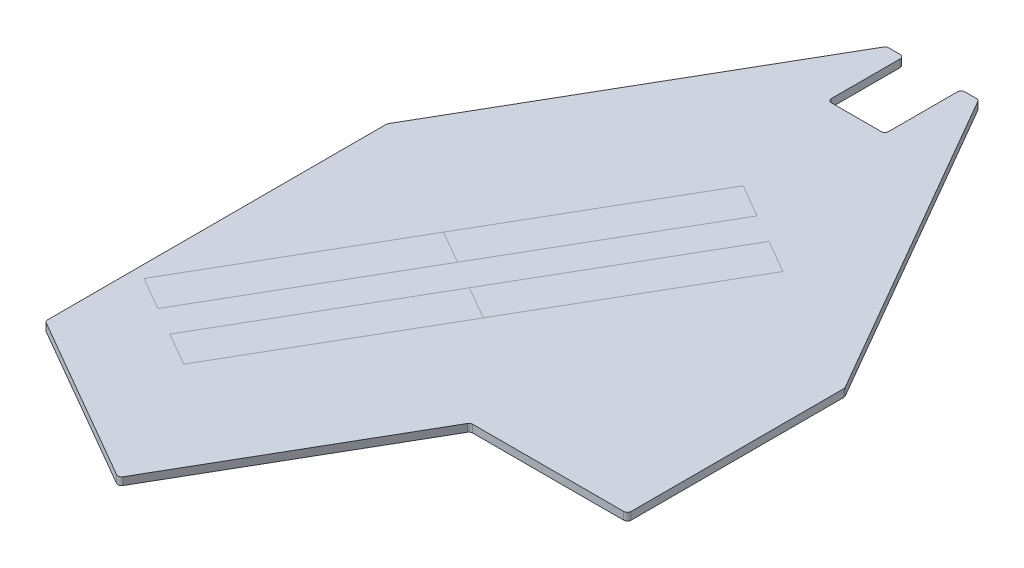
ISO-10303-21;
HEADER;
FILE_DESCRIPTION(('STEP AP214'),'2;1');
FILE_NAME('part.step','',(''),(''),'','','');
FILE_SCHEMA(('AUTOMOTIVE_DESIGN { 1 0 10303 214 1 1 1 1 }'));
ENDSEC;
DATA;
#1=APPLICATION_CONTEXT('core data for automotive mechanical design processes');
#2=APPLICATION_PROTOCOL_DEFINITION('international standard','automotive_design',2000,#1);
#3=PRODUCT_CONTEXT('',#1,'mechanical');
#4=PRODUCT('Part','Part','',(#3));
#5=PRODUCT_RELATED_PRODUCT_CATEGORY('part','',(#4));
#6=PRODUCT_DEFINITION_FORMATION('','',#4);
#7=PRODUCT_DEFINITION_CONTEXT('part definition',#1,'design');
#8=PRODUCT_DEFINITION('design','',#6,#7);
#9=PRODUCT_DEFINITION_SHAPE('','',#8);
#10=(LENGTH_UNIT() NAMED_UNIT(*) SI_UNIT(.MILLI.,.METRE.));
#11=(NAMED_UNIT(*) PLANE_ANGLE_UNIT() SI_UNIT($,.RADIAN.));
#12=(NAMED_UNIT(*) SI_UNIT($,.STERADIAN.) SOLID_ANGLE_UNIT());
#13=UNCERTAINTY_MEASURE_WITH_UNIT(LENGTH_MEASURE(1.E-05),#10,'distance_accuracy_value','');
#14=(GEOMETRIC_REPRESENTATION_CONTEXT(3) GLOBAL_UNCERTAINTY_ASSIGNED_CONTEXT((#13)) GLOBAL_UNIT_ASSIGNED_CONTEXT((#10,
#11,#12)) REPRESENTATION_CONTEXT('',''));
#15=CARTESIAN_POINT('',(0.,0.,0.));
#16=DIRECTION('',(0.,0.,1.));
#17=DIRECTION('',(1.,0.,0.));
#18=AXIS2_PLACEMENT_3D('',#15,#16,#17);
#19=CARTESIAN_POINT('',(-590.,20.,-567.320508075689));
#20=DIRECTION('',(0.,-1.,0.));
#21=DIRECTION('',(0.,0.,-1.));
#22=AXIS2_PLACEMENT_3D('',#19,#20,#21);
#23=PLANE('',#22);
#24=DIRECTION('',(0.866025403784438,0.,0.500000000000001));
#25=VECTOR('',#24,1.);
#26=CARTESIAN_POINT('',(-585.838374898212,20.,-574.52865419404));
#27=LINE('',#26,#25);
#28=CARTESIAN_POINT('',(-119.905707500847,20.,-305.52230324793));
#29=VERTEX_POINT('',#28);
#30=CARTESIAN_POINT('',(-33.3031671224033,20.,-255.52230324793));
#31=VERTEX_POINT('',#30);
#32=EDGE_CURVE('E11',#29,#31,#27,.T.);
#33=ORIENTED_EDGE('',*,*,#32,.F.);
#34=DIRECTION('',(-0.5,0.,0.866025403784439));
#35=VECTOR('',#34,1.);
#36=CARTESIAN_POINT('',(-124.067332602635,20.,-298.31415712958));
#37=LINE('',#36,#35);
#38=CARTESIAN_POINT('',(-407.405707500847,20.,192.442303928122));
#39=VERTEX_POINT('',#38);
#40=EDGE_CURVE('E328',#29,#39,#37,.T.);
#41=ORIENTED_EDGE('',*,*,#40,.T.);
#42=DIRECTION('',(0.866025403784439,0.,0.5));
#43=VECTOR('',#42,1.);
#44=CARTESIAN_POINT('',(-873.338374898212,20.,-76.5640470179867));
#45=LINE('',#44,#43);
#46=CARTESIAN_POINT('',(-320.803167122403,20.,242.442303928122));
#47=VERTEX_POINT('',#46);
#48=EDGE_CURVE('E339',#39,#47,#45,.T.);
#49=ORIENTED_EDGE('',*,*,#48,.T.);
#50=DIRECTION('',(0.5,0.,-0.866025403784439));
#51=VECTOR('',#50,1.);
#52=CARTESIAN_POINT('',(-37.464792224191,20.,-248.31415712958));
#53=LINE('',#52,#51);
#54=EDGE_CURVE('E336',#47,#31,#53,.T.);
#55=ORIENTED_EDGE('',*,*,#54,.T.);
#56=EDGE_LOOP('',(#33,#41,#49,#55));
#57=FACE_BOUND('',#56,.T.);
#58=ADVANCED_FACE('F46',(#57),#23,.F.);
#59=DIRECTION('',(0.866025403784438,0.,0.500000000000001));
#60=VECTOR('',#59,1.);
#61=CARTESIAN_POINT('',(-585.838374898212,20.,-574.52865419404));
#62=LINE('',#61,#60);
#63=CARTESIAN_POINT('',(-280.120407200968,20.,-398.02230324793));
#64=VERTEX_POINT('',#63);
#65=CARTESIAN_POINT('',(-193.517866822525,20.,-348.02230324793));
#66=VERTEX_POINT('',#65);
#67=EDGE_CURVE('E55',#64,#66,#62,.T.);
#68=ORIENTED_EDGE('',*,*,#67,.F.);
#69=DIRECTION('',(-0.5,0.,0.866025403784439));
#70=VECTOR('',#69,1.);
#71=CARTESIAN_POINT('',(-284.282032302756,20.,-390.81415712958));
#72=LINE('',#71,#70);
#73=CARTESIAN_POINT('',(-567.620407200969,20.,99.9423039281221));
#74=VERTEX_POINT('',#73);
#75=EDGE_CURVE('E354',#64,#74,#72,.T.);
#76=ORIENTED_EDGE('',*,*,#75,.T.);
#77=DIRECTION('',(0.866025403784439,0.,0.5));
#78=VECTOR('',#77,1.);
#79=CARTESIAN_POINT('',(-873.338374898212,20.,-76.5640470179867));
#80=LINE('',#79,#78);
#81=CARTESIAN_POINT('',(-481.017866822524,20.,149.942303928122));
#82=VERTEX_POINT('',#81);
#83=EDGE_CURVE('E351',#74,#82,#80,.T.);
#84=ORIENTED_EDGE('',*,*,#83,.T.);
#85=DIRECTION('',(0.5,0.,-0.866025403784439));
#86=VECTOR('',#85,1.);
#87=CARTESIAN_POINT('',(-197.679491924312,20.,-340.81415712958));
#88=LINE('',#87,#86);
#89=EDGE_CURVE('E347',#82,#66,#88,.T.);
#90=ORIENTED_EDGE('',*,*,#89,.T.);
#91=EDGE_LOOP('',(#68,#76,#84,#90));
#92=FACE_BOUND('',#91,.T.);
#93=ADVANCED_FACE('F370',(#92),#23,.F.);
#94=ORIENTED_EDGE('',*,*,#48,.F.);
#95=ORIENTED_EDGE('',*,*,#40,.F.);
#96=CARTESIAN_POINT('',(167.594292499153,20.,-803.486910423983));
#97=VERTEX_POINT('',#96);
#98=EDGE_CURVE('E329',#97,#29,#37,.T.);
#99=ORIENTED_EDGE('',*,*,#98,.F.);
#100=DIRECTION('',(-0.86602540378444,0.,-0.499999999999998));
#101=VECTOR('',#100,1.);
#102=CARTESIAN_POINT('',(-298.338374898214,20.,-1072.49326137009));
#103=LINE('',#102,#101);
#104=CARTESIAN_POINT('',(254.196832877596,20.,-753.486910423983));
#105=VERTEX_POINT('',#104);
#106=EDGE_CURVE('E332',#105,#97,#103,.T.);
#107=ORIENTED_EDGE('',*,*,#106,.F.);
#108=EDGE_CURVE('E335',#31,#105,#53,.T.);
#109=ORIENTED_EDGE('',*,*,#108,.F.);
#110=ORIENTED_EDGE('',*,*,#54,.F.);
#111=EDGE_LOOP('',(#94,#95,#99,#107,#109,#110));
#112=FACE_BOUND('',#111,.T.);
#113=DIRECTION('',(0.,0.,1.));
#114=VECTOR('',#113,1.);
#115=CARTESIAN_POINT('',(-600.,20.,320.270948753858));
#116=LINE('',#115,#114);
#117=CARTESIAN_POINT('',(-600.,20.,-567.320508075689));
#118=VERTEX_POINT('',#117);
#119=CARTESIAN_POINT('',(-600.,20.,320.270948753858));
#120=VERTEX_POINT('',#119);
#121=EDGE_CURVE('E286',#118,#120,#116,.T.);
#122=ORIENTED_EDGE('',*,*,#121,.T.);
#123=CARTESIAN_POINT('',(-590.,20.,320.270948753858));
#124=DIRECTION('',(0.,1.,0.));
#125=DIRECTION('',(0.,0.,-1.));
#126=AXIS2_PLACEMENT_3D('',#123,#124,#125);
#127=CIRCLE('',#126,9.99999999999999);
#128=CARTESIAN_POINT('',(-595.,20.,328.931202791703));
#129=VERTEX_POINT('',#128);
#130=EDGE_CURVE('E277',#120,#129,#127,.T.);
#131=ORIENTED_EDGE('',*,*,#130,.T.);
#132=DIRECTION('',(0.866025403784441,0.,0.499999999999996));
#133=VECTOR('',#132,1.);
#134=CARTESIAN_POINT('',(-158.335291949227,20.,581.039689530423));
#135=LINE('',#134,#133);
#136=CARTESIAN_POINT('',(-158.335291949227,20.,581.039689530423));
#137=VERTEX_POINT('',#136);
#138=EDGE_CURVE('E285',#129,#137,#135,.T.);
#139=ORIENTED_EDGE('',*,*,#138,.T.);
#140=CARTESIAN_POINT('',(-153.335291949227,20.,572.379435492579));
#141=DIRECTION('',(0.,1.,0.));
#142=DIRECTION('',(0.,0.,1.));
#143=AXIS2_PLACEMENT_3D('',#140,#141,#142);
#144=CIRCLE('',#143,9.99999999999996);
#145=CARTESIAN_POINT('',(-144.675037911383,20.,577.379435492579));
#146=VERTEX_POINT('',#145);
#147=EDGE_CURVE('E781',#137,#146,#144,.T.);
#148=ORIENTED_EDGE('',*,*,#147,.T.);
#149=DIRECTION('',(0.499999999999999,0.,-0.866025403784439));
#150=VECTOR('',#149,1.);
#151=CARTESIAN_POINT('',(-144.675037911383,20.,577.379435492579));
#152=LINE('',#151,#150);
#153=CARTESIAN_POINT('',(185.788383248863,20.,5.00000000000028));
#154=VERTEX_POINT('',#153);
#155=EDGE_CURVE('E902',#146,#154,#152,.T.);
#156=ORIENTED_EDGE('',*,*,#155,.T.);
#157=CARTESIAN_POINT('',(194.448637286707,20.,10.0000000000002));
#158=DIRECTION('',(0.,-1.,0.));
#159=DIRECTION('',(0.,0.,-1.));
#160=AXIS2_PLACEMENT_3D('',#157,#158,#159);
#161=CIRCLE('',#160,10.);
#162=CARTESIAN_POINT('',(194.448637286708,20.,2.19959282346926E-13));
#163=VERTEX_POINT('',#162);
#164=EDGE_CURVE('E904',#154,#163,#161,.T.);
#165=ORIENTED_EDGE('',*,*,#164,.T.);
#166=DIRECTION('',(1.,0.,0.));
#167=VECTOR('',#166,1.);
#168=CARTESIAN_POINT('',(590.,20.,0.));
#169=LINE('',#168,#167);
#170=CARTESIAN_POINT('',(590.,20.,0.));
#171=VERTEX_POINT('',#170);
#172=EDGE_CURVE('E906',#163,#171,#169,.T.);
#173=ORIENTED_EDGE('',*,*,#172,.T.);
#174=CARTESIAN_POINT('',(590.,20.,-9.99999999999992));
#175=DIRECTION('',(0.,1.,0.));
#176=DIRECTION('',(0.,0.,-1.));
#177=AXIS2_PLACEMENT_3D('',#174,#175,#176);
#178=CIRCLE('',#177,10.);
#179=CARTESIAN_POINT('',(600.,20.,-9.99999999999999));
#180=VERTEX_POINT('',#179);
#181=EDGE_CURVE('E912',#171,#180,#178,.T.);
#182=ORIENTED_EDGE('',*,*,#181,.T.);
#183=DIRECTION('',(0.,0.,-1.));
#184=VECTOR('',#183,1.);
#185=CARTESIAN_POINT('',(600.,20.,-9.99999999999999));
#186=LINE('',#185,#184);
#187=CARTESIAN_POINT('',(600.,20.,-567.320508075689));
#188=VERTEX_POINT('',#187);
#189=EDGE_CURVE('E914',#180,#188,#186,.T.);
#190=ORIENTED_EDGE('',*,*,#189,.T.);
#191=CARTESIAN_POINT('',(590.,20.,-567.320508075689));
#192=DIRECTION('',(0.,1.,0.));
#193=DIRECTION('',(0.,0.,-1.));
#194=AXIS2_PLACEMENT_3D('',#191,#192,#193);
#195=CIRCLE('',#194,10.);
#196=CARTESIAN_POINT('',(598.660254037844,20.,-572.320508075689));
#197=VERTEX_POINT('',#196);
#198=EDGE_CURVE('E916',#188,#197,#195,.T.);
#199=ORIENTED_EDGE('',*,*,#198,.T.);
#200=DIRECTION('',(-0.500000000000004,0.,-0.866025403784436));
#201=VECTOR('',#200,1.);
#202=CARTESIAN_POINT('',(598.660254037844,20.,-572.320508075689));
#203=LINE('',#202,#201);
#204=CARTESIAN_POINT('',(123.686027918554,20.,-1395.));
#205=VERTEX_POINT('',#204);
#206=EDGE_CURVE('E918',#197,#205,#203,.T.);
#207=ORIENTED_EDGE('',*,*,#206,.T.);
#208=CARTESIAN_POINT('',(115.025773880709,20.,-1390.));
#209=DIRECTION('',(0.,1.,0.));
#210=DIRECTION('',(0.,0.,-1.));
#211=AXIS2_PLACEMENT_3D('',#208,#209,#210);
#212=CIRCLE('',#211,9.99999999999998);
#213=CARTESIAN_POINT('',(115.025773880709,20.,-1400.));
#214=VERTEX_POINT('',#213);
#215=EDGE_CURVE('E920',#205,#214,#212,.T.);
#216=ORIENTED_EDGE('',*,*,#215,.T.);
#217=DIRECTION('',(-1.,0.,0.));
#218=VECTOR('',#217,1.);
#219=CARTESIAN_POINT('',(115.025773880709,20.,-1400.));
#220=LINE('',#219,#218);
#221=CARTESIAN_POINT('',(85.,20.,-1400.));
#222=VERTEX_POINT('',#221);
#223=EDGE_CURVE('E922',#214,#222,#220,.T.);
#224=ORIENTED_EDGE('',*,*,#223,.T.);
#225=CARTESIAN_POINT('',(85.,20.,-1390.));
#226=DIRECTION('',(0.,1.,0.));
#227=DIRECTION('',(0.,0.,-1.));
#228=AXIS2_PLACEMENT_3D('',#225,#226,#227);
#229=CIRCLE('',#228,10.);
#230=CARTESIAN_POINT('',(75.,20.,-1390.));
#231=VERTEX_POINT('',#230);
#232=EDGE_CURVE('E924',#222,#231,#229,.T.);
#233=ORIENTED_EDGE('',*,*,#232,.T.);
#234=DIRECTION('',(0.,0.,1.));
#235=VECTOR('',#234,1.);
#236=CARTESIAN_POINT('',(75.,20.,-1390.));
#237=LINE('',#236,#235);
#238=CARTESIAN_POINT('',(75.,20.,-1210.));
#239=VERTEX_POINT('',#238);
#240=EDGE_CURVE('E926',#231,#239,#237,.T.);
#241=ORIENTED_EDGE('',*,*,#240,.T.);
#242=CARTESIAN_POINT('',(65.,20.,-1210.));
#243=DIRECTION('',(0.,-1.,0.));
#244=DIRECTION('',(0.,0.,-1.));
#245=AXIS2_PLACEMENT_3D('',#242,#243,#244);
#246=CIRCLE('',#245,10.);
#247=CARTESIAN_POINT('',(64.9999999999999,20.,-1200.));
#248=VERTEX_POINT('',#247);
#249=EDGE_CURVE('E928',#239,#248,#246,.T.);
#250=ORIENTED_EDGE('',*,*,#249,.T.);
#251=DIRECTION('',(-1.,0.,0.));
#252=VECTOR('',#251,1.);
#253=CARTESIAN_POINT('',(-64.9999999999999,20.,-1200.));
#254=LINE('',#253,#252);
#255=CARTESIAN_POINT('',(-65.,20.,-1200.));
#256=VERTEX_POINT('',#255);
#257=EDGE_CURVE('E930',#248,#256,#254,.T.);
#258=ORIENTED_EDGE('',*,*,#257,.T.);
#259=CARTESIAN_POINT('',(-65.,20.,-1210.));
#260=DIRECTION('',(0.,-1.,0.));
#261=DIRECTION('',(0.,0.,1.));
#262=AXIS2_PLACEMENT_3D('',#259,#260,#261);
#263=CIRCLE('',#262,10.);
#264=CARTESIAN_POINT('',(-75.,20.,-1210.));
#265=VERTEX_POINT('',#264);
#266=EDGE_CURVE('E932',#256,#265,#263,.T.);
#267=ORIENTED_EDGE('',*,*,#266,.T.);
#268=DIRECTION('',(0.,0.,-1.));
#269=VECTOR('',#268,1.);
#270=CARTESIAN_POINT('',(-75.,20.,-1390.));
#271=LINE('',#270,#269);
#272=CARTESIAN_POINT('',(-75.,20.,-1390.));
#273=VERTEX_POINT('',#272);
#274=EDGE_CURVE('E934',#265,#273,#271,.T.);
#275=ORIENTED_EDGE('',*,*,#274,.T.);
#276=CARTESIAN_POINT('',(-85.,20.,-1390.));
#277=DIRECTION('',(0.,1.,0.));
#278=DIRECTION('',(0.,0.,-1.));
#279=AXIS2_PLACEMENT_3D('',#276,#277,#278);
#280=CIRCLE('',#279,10.);
#281=CARTESIAN_POINT('',(-85.0000000000001,20.,-1400.));
#282=VERTEX_POINT('',#281);
#283=EDGE_CURVE('E936',#273,#282,#280,.T.);
#284=ORIENTED_EDGE('',*,*,#283,.T.);
#285=DIRECTION('',(-1.,0.,0.));
#286=VECTOR('',#285,1.);
#287=CARTESIAN_POINT('',(-115.025773880709,20.,-1400.));
#288=LINE('',#287,#286);
#289=CARTESIAN_POINT('',(-115.025773880709,20.,-1400.));
#290=VERTEX_POINT('',#289);
#291=EDGE_CURVE('E938',#282,#290,#288,.T.);
#292=ORIENTED_EDGE('',*,*,#291,.T.);
#293=CARTESIAN_POINT('',(-115.025773880709,20.,-1390.));
#294=DIRECTION('',(0.,1.,0.));
#295=DIRECTION('',(0.,0.,-1.));
#296=AXIS2_PLACEMENT_3D('',#293,#294,#295);
#297=CIRCLE('',#296,10.0000000000001);
#298=CARTESIAN_POINT('',(-123.686027918554,20.,-1395.));
#299=VERTEX_POINT('',#298);
#300=EDGE_CURVE('E940',#290,#299,#297,.T.);
#301=ORIENTED_EDGE('',*,*,#300,.T.);
#302=DIRECTION('',(-0.500000000000004,0.,0.866025403784436));
#303=VECTOR('',#302,1.);
#304=CARTESIAN_POINT('',(-598.660254037844,20.,-572.320508075689));
#305=LINE('',#304,#303);
#306=CARTESIAN_POINT('',(-598.660254037844,20.,-572.320508075689));
#307=VERTEX_POINT('',#306);
#308=EDGE_CURVE('E942',#299,#307,#305,.T.);
#309=ORIENTED_EDGE('',*,*,#308,.T.);
#310=CARTESIAN_POINT('',(-590.,20.,-567.320508075689));
#311=DIRECTION('',(0.,1.,0.));
#312=DIRECTION('',(0.,0.,-1.));
#313=AXIS2_PLACEMENT_3D('',#310,#311,#312);
#314=CIRCLE('',#313,10.);
#315=EDGE_CURVE('E292',#307,#118,#314,.T.);
#316=ORIENTED_EDGE('',*,*,#315,.T.);
#317=EDGE_LOOP('',(#122,#131,#139,#148,#156,#165,#173,#182,#190,#199,#207,#216,#224,#233,#241,
#250,#258,#267,#275,#284,#292,#301,#309,#316));
#318=FACE_BOUND('',#317,.T.);
#319=CARTESIAN_POINT('',(7.37959279903144,20.,-895.986910423983));
#320=VERTEX_POINT('',#319);
#321=EDGE_CURVE('E355',#320,#64,#72,.T.);
#322=ORIENTED_EDGE('',*,*,#321,.F.);
#323=DIRECTION('',(-0.866025403784439,0.,-0.5));
#324=VECTOR('',#323,1.);
#325=CARTESIAN_POINT('',(-298.338374898212,20.,-1072.49326137009));
#326=LINE('',#325,#324);
#327=CARTESIAN_POINT('',(93.9821331774753,20.,-845.986910423983));
#328=VERTEX_POINT('',#327);
#329=EDGE_CURVE('E342',#328,#320,#326,.T.);
#330=ORIENTED_EDGE('',*,*,#329,.F.);
#331=EDGE_CURVE('E346',#66,#328,#88,.T.);
#332=ORIENTED_EDGE('',*,*,#331,.F.);
#333=ORIENTED_EDGE('',*,*,#89,.F.);
#334=ORIENTED_EDGE('',*,*,#83,.F.);
#335=ORIENTED_EDGE('',*,*,#75,.F.);
#336=EDGE_LOOP('',(#322,#330,#332,#333,#334,#335));
#337=FACE_BOUND('',#336,.T.);
#338=ADVANCED_FACE('F289',(#112,#318,#337),#23,.F.);
#339=ORIENTED_EDGE('',*,*,#321,.T.);
#340=ORIENTED_EDGE('',*,*,#67,.T.);
#341=ORIENTED_EDGE('',*,*,#331,.T.);
#342=ORIENTED_EDGE('',*,*,#329,.T.);
#343=EDGE_LOOP('',(#339,#340,#341,#342));
#344=FACE_BOUND('',#343,.T.);
#345=ADVANCED_FACE('F364',(#344),#23,.F.);
#346=CARTESIAN_POINT('',(-590.,0.,-567.320508075689));
#347=DIRECTION('',(0.,-1.,0.));
#348=DIRECTION('',(0.,0.,-1.));
#349=AXIS2_PLACEMENT_3D('',#346,#347,#348);
#350=PLANE('',#349);
#351=DIRECTION('',(0.,0.,-1.));
#352=VECTOR('',#351,1.);
#353=CARTESIAN_POINT('',(-75.,0.,-1390.));
#354=LINE('',#353,#352);
#355=CARTESIAN_POINT('',(-75.,0.,-1366.14667397366));
#356=VERTEX_POINT('',#355);
#357=CARTESIAN_POINT('',(-75.,0.,-1390.));
#358=VERTEX_POINT('',#357);
#359=EDGE_CURVE('E822',#356,#358,#354,.T.);
#360=ORIENTED_EDGE('',*,*,#359,.F.);
#361=DIRECTION('',(-0.5,0.,0.866025403784439));
#362=VECTOR('',#361,1.);
#363=CARTESIAN_POINT('',(-549.651876437683,0.,-544.025508075689));
#364=LINE('',#363,#362);
#365=CARTESIAN_POINT('',(-600.,0.,-456.82));
#366=VERTEX_POINT('',#365);
#367=EDGE_CURVE('E325',#356,#366,#364,.T.);
#368=ORIENTED_EDGE('',*,*,#367,.T.);
#369=DIRECTION('',(0.,0.,1.));
#370=VECTOR('',#369,1.);
#371=CARTESIAN_POINT('',(-600.,0.,0.));
#372=LINE('',#371,#370);
#373=CARTESIAN_POINT('',(-600.,0.,-567.320508075689));
#374=VERTEX_POINT('',#373);
#375=EDGE_CURVE('E296',#374,#366,#372,.T.);
#376=ORIENTED_EDGE('',*,*,#375,.F.);
#377=CARTESIAN_POINT('',(-590.,0.,-567.320508075689));
#378=DIRECTION('',(0.,1.,0.));
#379=DIRECTION('',(0.,0.,-1.));
#380=AXIS2_PLACEMENT_3D('',#377,#378,#379);
#381=CIRCLE('',#380,10.);
#382=CARTESIAN_POINT('',(-598.660254037844,0.,-572.320508075689));
#383=VERTEX_POINT('',#382);
#384=EDGE_CURVE('E835',#383,#374,#381,.T.);
#385=ORIENTED_EDGE('',*,*,#384,.F.);
#386=DIRECTION('',(-0.500000000000004,0.,0.866025403784436));
#387=VECTOR('',#386,1.);
#388=CARTESIAN_POINT('',(-598.660254037844,0.,-572.320508075689));
#389=LINE('',#388,#387);
#390=CARTESIAN_POINT('',(-123.686027918554,0.,-1395.));
#391=VERTEX_POINT('',#390);
#392=EDGE_CURVE('E833',#391,#383,#389,.T.);
#393=ORIENTED_EDGE('',*,*,#392,.F.);
#394=CARTESIAN_POINT('',(-115.025773880709,0.,-1390.));
#395=DIRECTION('',(0.,1.,0.));
#396=DIRECTION('',(0.,0.,-1.));
#397=AXIS2_PLACEMENT_3D('',#394,#395,#396);
#398=CIRCLE('',#397,10.0000000000001);
#399=CARTESIAN_POINT('',(-115.025773880709,0.,-1400.));
#400=VERTEX_POINT('',#399);
#401=EDGE_CURVE('E831',#400,#391,#398,.T.);
#402=ORIENTED_EDGE('',*,*,#401,.F.);
#403=DIRECTION('',(-1.,0.,0.));
#404=VECTOR('',#403,1.);
#405=CARTESIAN_POINT('',(-115.025773880709,0.,-1400.));
#406=LINE('',#405,#404);
#407=CARTESIAN_POINT('',(-85.0000000000001,0.,-1400.));
#408=VERTEX_POINT('',#407);
#409=EDGE_CURVE('E829',#408,#400,#406,.T.);
#410=ORIENTED_EDGE('',*,*,#409,.F.);
#411=CARTESIAN_POINT('',(-85.,0.,-1390.));
#412=DIRECTION('',(0.,1.,0.));
#413=DIRECTION('',(0.,0.,-1.));
#414=AXIS2_PLACEMENT_3D('',#411,#412,#413);
#415=CIRCLE('',#414,10.);
#416=EDGE_CURVE('E826',#358,#408,#415,.T.);
#417=ORIENTED_EDGE('',*,*,#416,.F.);
#418=EDGE_LOOP('',(#360,#368,#376,#385,#393,#402,#410,#417));
#419=FACE_BOUND('',#418,.T.);
#420=ADVANCED_FACE('F427',(#419),#350,.T.);
#421=CARTESIAN_POINT('',(-600.,0.,-336.82));
#422=VERTEX_POINT('',#421);
#423=CARTESIAN_POINT('',(-600.,0.,-94.3399999999998));
#424=VERTEX_POINT('',#423);
#425=EDGE_CURVE('E839',#422,#424,#372,.T.);
#426=ORIENTED_EDGE('',*,*,#425,.F.);
#427=DIRECTION('',(0.5,0.,-0.866025403784439));
#428=VECTOR('',#427,1.);
#429=CARTESIAN_POINT('',(-497.690352210617,0.,-514.025508075689));
#430=LINE('',#429,#428);
#431=CARTESIAN_POINT('',(-75.0000000000001,0.,-1246.14667397366));
#432=VERTEX_POINT('',#431);
#433=EDGE_CURVE('E322',#422,#432,#430,.T.);
#434=ORIENTED_EDGE('',*,*,#433,.T.);
#435=CARTESIAN_POINT('',(-75.,0.,-1210.));
#436=VERTEX_POINT('',#435);
#437=EDGE_CURVE('E823',#436,#432,#354,.T.);
#438=ORIENTED_EDGE('',*,*,#437,.F.);
#439=CARTESIAN_POINT('',(-65.,0.,-1210.));
#440=DIRECTION('',(0.,-1.,0.));
#441=DIRECTION('',(0.,0.,1.));
#442=AXIS2_PLACEMENT_3D('',#439,#440,#441);
#443=CIRCLE('',#442,10.);
#444=CARTESIAN_POINT('',(-65.,0.,-1200.));
#445=VERTEX_POINT('',#444);
#446=EDGE_CURVE('E820',#445,#436,#443,.T.);
#447=ORIENTED_EDGE('',*,*,#446,.F.);
#448=DIRECTION('',(-1.,0.,0.));
#449=VECTOR('',#448,1.);
#450=CARTESIAN_POINT('',(-64.9999999999999,0.,-1200.));
#451=LINE('',#450,#449);
#452=CARTESIAN_POINT('',(64.9999999999999,0.,-1200.));
#453=VERTEX_POINT('',#452);
#454=EDGE_CURVE('E818',#453,#445,#451,.T.);
#455=ORIENTED_EDGE('',*,*,#454,.F.);
#456=CARTESIAN_POINT('',(65.,0.,-1210.));
#457=DIRECTION('',(0.,-1.,0.));
#458=DIRECTION('',(0.,0.,-1.));
#459=AXIS2_PLACEMENT_3D('',#456,#457,#458);
#460=CIRCLE('',#459,10.);
#461=CARTESIAN_POINT('',(75.,0.,-1210.));
#462=VERTEX_POINT('',#461);
#463=EDGE_CURVE('E815',#462,#453,#460,.T.);
#464=ORIENTED_EDGE('',*,*,#463,.F.);
#465=DIRECTION('',(0.,0.,1.));
#466=VECTOR('',#465,1.);
#467=CARTESIAN_POINT('',(75.,0.,-1390.));
#468=LINE('',#467,#466);
#469=CARTESIAN_POINT('',(75.,0.,-1246.14667397366));
#470=VERTEX_POINT('',#469);
#471=EDGE_CURVE('E811',#470,#462,#468,.T.);
#472=ORIENTED_EDGE('',*,*,#471,.F.);
#473=DIRECTION('',(0.5,0.,0.866025403784439));
#474=VECTOR('',#473,1.);
#475=CARTESIAN_POINT('',(202.690352210617,0.,-1024.98049630851));
#476=LINE('',#475,#474);
#477=CARTESIAN_POINT('',(600.,0.,-336.819999999999));
#478=VERTEX_POINT('',#477);
#479=EDGE_CURVE('E316',#470,#478,#476,.T.);
#480=ORIENTED_EDGE('',*,*,#479,.T.);
#481=DIRECTION('',(0.,0.,-1.));
#482=VECTOR('',#481,1.);
#483=CARTESIAN_POINT('',(600.,0.,-9.99999999999999));
#484=LINE('',#483,#482);
#485=CARTESIAN_POINT('',(600.,0.,-94.3399999999998));
#486=VERTEX_POINT('',#485);
#487=EDGE_CURVE('E957',#486,#478,#484,.T.);
#488=ORIENTED_EDGE('',*,*,#487,.F.);
#489=DIRECTION('',(-1.,0.,0.));
#490=VECTOR('',#489,1.);
#491=CARTESIAN_POINT('',(-590.,0.,-94.3399999999999));
#492=LINE('',#491,#490);
#493=EDGE_CURVE('E304',#486,#424,#492,.T.);
#494=ORIENTED_EDGE('',*,*,#493,.T.);
#495=EDGE_LOOP('',(#426,#434,#438,#447,#455,#464,#472,#480,#488,#494));
#496=FACE_BOUND('',#495,.T.);
#497=ADVANCED_FACE('F437',(#496),#350,.T.);
#498=CARTESIAN_POINT('',(600.,0.,-456.82));
#499=VERTEX_POINT('',#498);
#500=CARTESIAN_POINT('',(600.,0.,-567.320508075689));
#501=VERTEX_POINT('',#500);
#502=EDGE_CURVE('E796',#499,#501,#484,.T.);
#503=ORIENTED_EDGE('',*,*,#502,.F.);
#504=DIRECTION('',(-0.5,0.,-0.866025403784439));
#505=VECTOR('',#504,1.);
#506=CARTESIAN_POINT('',(254.651876437683,0.,-1054.98049630851));
#507=LINE('',#506,#505);
#508=CARTESIAN_POINT('',(75.,0.,-1366.14667397366));
#509=VERTEX_POINT('',#508);
#510=EDGE_CURVE('E319',#499,#509,#507,.T.);
#511=ORIENTED_EDGE('',*,*,#510,.T.);
#512=CARTESIAN_POINT('',(75.,0.,-1390.));
#513=VERTEX_POINT('',#512);
#514=EDGE_CURVE('E812',#513,#509,#468,.T.);
#515=ORIENTED_EDGE('',*,*,#514,.F.);
#516=CARTESIAN_POINT('',(85.,0.,-1390.));
#517=DIRECTION('',(0.,1.,0.));
#518=DIRECTION('',(0.,0.,-1.));
#519=AXIS2_PLACEMENT_3D('',#516,#517,#518);
#520=CIRCLE('',#519,10.);
#521=CARTESIAN_POINT('',(85.,0.,-1400.));
#522=VERTEX_POINT('',#521);
#523=EDGE_CURVE('E809',#522,#513,#520,.T.);
#524=ORIENTED_EDGE('',*,*,#523,.F.);
#525=DIRECTION('',(-1.,0.,0.));
#526=VECTOR('',#525,1.);
#527=CARTESIAN_POINT('',(115.025773880709,0.,-1400.));
#528=LINE('',#527,#526);
#529=CARTESIAN_POINT('',(115.025773880709,0.,-1400.));
#530=VERTEX_POINT('',#529);
#531=EDGE_CURVE('E807',#530,#522,#528,.T.);
#532=ORIENTED_EDGE('',*,*,#531,.F.);
#533=CARTESIAN_POINT('',(115.025773880709,0.,-1390.));
#534=DIRECTION('',(0.,1.,0.));
#535=DIRECTION('',(0.,0.,-1.));
#536=AXIS2_PLACEMENT_3D('',#533,#534,#535);
#537=CIRCLE('',#536,9.99999999999998);
#538=CARTESIAN_POINT('',(123.686027918554,0.,-1395.));
#539=VERTEX_POINT('',#538);
#540=EDGE_CURVE('E805',#539,#530,#537,.T.);
#541=ORIENTED_EDGE('',*,*,#540,.F.);
#542=DIRECTION('',(-0.500000000000004,0.,-0.866025403784436));
#543=VECTOR('',#542,1.);
#544=CARTESIAN_POINT('',(598.660254037844,0.,-572.320508075689));
#545=LINE('',#544,#543);
#546=CARTESIAN_POINT('',(598.660254037844,0.,-572.320508075689));
#547=VERTEX_POINT('',#546);
#548=EDGE_CURVE('E803',#547,#539,#545,.T.);
#549=ORIENTED_EDGE('',*,*,#548,.F.);
#550=CARTESIAN_POINT('',(590.,0.,-567.320508075689));
#551=DIRECTION('',(0.,1.,0.));
#552=DIRECTION('',(0.,0.,-1.));
#553=AXIS2_PLACEMENT_3D('',#550,#551,#552);
#554=CIRCLE('',#553,10.);
#555=EDGE_CURVE('E800',#501,#547,#554,.T.);
#556=ORIENTED_EDGE('',*,*,#555,.F.);
#557=EDGE_LOOP('',(#503,#511,#515,#524,#532,#541,#549,#556));
#558=FACE_BOUND('',#557,.T.);
#559=ADVANCED_FACE('F522',(#558),#350,.T.);
#560=ORIENTED_EDGE('',*,*,#367,.F.);
#561=EDGE_CURVE('E827',#432,#356,#354,.T.);
#562=ORIENTED_EDGE('',*,*,#561,.F.);
#563=ORIENTED_EDGE('',*,*,#433,.F.);
#564=EDGE_CURVE('E838',#366,#422,#372,.T.);
#565=ORIENTED_EDGE('',*,*,#564,.F.);
#566=EDGE_LOOP('',(#560,#562,#563,#565));
#567=FACE_BOUND('',#566,.T.);
#568=ADVANCED_FACE('F514',(#567),#350,.T.);
#569=CARTESIAN_POINT('',(-600.,0.,-34.3399999999999));
#570=VERTEX_POINT('',#569);
#571=CARTESIAN_POINT('',(-600.,0.,320.270948753858));
#572=VERTEX_POINT('',#571);
#573=EDGE_CURVE('E302',#570,#572,#372,.T.);
#574=ORIENTED_EDGE('',*,*,#573,.F.);
#575=DIRECTION('',(1.,0.,0.));
#576=VECTOR('',#575,1.);
#577=CARTESIAN_POINT('',(-590.,0.,-34.3399999999999));
#578=LINE('',#577,#576);
#579=CARTESIAN_POINT('',(600.,0.,-34.3399999999999));
#580=VERTEX_POINT('',#579);
#581=EDGE_CURVE('E308',#570,#580,#578,.T.);
#582=ORIENTED_EDGE('',*,*,#581,.T.);
#583=CARTESIAN_POINT('',(600.,0.,-9.99999999999999));
#584=VERTEX_POINT('',#583);
#585=EDGE_CURVE('E797',#584,#580,#484,.T.);
#586=ORIENTED_EDGE('',*,*,#585,.F.);
#587=CARTESIAN_POINT('',(590.,0.,-9.99999999999992));
#588=DIRECTION('',(0.,1.,0.));
#589=DIRECTION('',(0.,0.,-1.));
#590=AXIS2_PLACEMENT_3D('',#587,#588,#589);
#591=CIRCLE('',#590,10.);
#592=CARTESIAN_POINT('',(590.,0.,0.));
#593=VERTEX_POINT('',#592);
#594=EDGE_CURVE('E794',#593,#584,#591,.T.);
#595=ORIENTED_EDGE('',*,*,#594,.F.);
#596=DIRECTION('',(1.,0.,0.));
#597=VECTOR('',#596,1.);
#598=CARTESIAN_POINT('',(590.,0.,0.));
#599=LINE('',#598,#597);
#600=CARTESIAN_POINT('',(194.448637286708,0.,2.19959282346926E-13));
#601=VERTEX_POINT('',#600);
#602=EDGE_CURVE('E792',#601,#593,#599,.T.);
#603=ORIENTED_EDGE('',*,*,#602,.F.);
#604=CARTESIAN_POINT('',(194.448637286707,0.,10.0000000000002));
#605=DIRECTION('',(0.,-1.,0.));
#606=DIRECTION('',(0.,0.,-1.));
#607=AXIS2_PLACEMENT_3D('',#604,#605,#606);
#608=CIRCLE('',#607,10.);
#609=CARTESIAN_POINT('',(185.788383248863,0.,5.00000000000028));
#610=VERTEX_POINT('',#609);
#611=EDGE_CURVE('E787',#610,#601,#608,.T.);
#612=ORIENTED_EDGE('',*,*,#611,.F.);
#613=DIRECTION('',(0.499999999999999,0.,-0.866025403784439));
#614=VECTOR('',#613,1.);
#615=CARTESIAN_POINT('',(-144.675037911383,0.,577.379435492579));
#616=LINE('',#615,#614);
#617=CARTESIAN_POINT('',(-144.675037911383,0.,577.379435492579));
#618=VERTEX_POINT('',#617);
#619=EDGE_CURVE('E785',#618,#610,#616,.T.);
#620=ORIENTED_EDGE('',*,*,#619,.F.);
#621=CARTESIAN_POINT('',(-153.335291949227,0.,572.379435492579));
#622=DIRECTION('',(0.,1.,0.));
#623=DIRECTION('',(0.,0.,1.));
#624=AXIS2_PLACEMENT_3D('',#621,#622,#623);
#625=CIRCLE('',#624,9.99999999999996);
#626=CARTESIAN_POINT('',(-158.335291949227,0.,581.039689530423));
#627=VERTEX_POINT('',#626);
#628=EDGE_CURVE('E776',#627,#618,#625,.T.);
#629=ORIENTED_EDGE('',*,*,#628,.F.);
#630=DIRECTION('',(0.866025403784441,0.,0.499999999999996));
#631=VECTOR('',#630,1.);
#632=CARTESIAN_POINT('',(-158.335291949227,0.,581.039689530423));
#633=LINE('',#632,#631);
#634=CARTESIAN_POINT('',(-595.,0.,328.931202791703));
#635=VERTEX_POINT('',#634);
#636=EDGE_CURVE('E772',#635,#627,#633,.T.);
#637=ORIENTED_EDGE('',*,*,#636,.F.);
#638=CARTESIAN_POINT('',(-590.,0.,320.270948753858));
#639=DIRECTION('',(0.,1.,0.));
#640=DIRECTION('',(0.,0.,-1.));
#641=AXIS2_PLACEMENT_3D('',#638,#639,#640);
#642=CIRCLE('',#641,9.99999999999999);
#643=EDGE_CURVE('E777',#572,#635,#642,.T.);
#644=ORIENTED_EDGE('',*,*,#643,.F.);
#645=EDGE_LOOP('',(#574,#582,#586,#595,#603,#612,#620,#629,#637,#644));
#646=FACE_BOUND('',#645,.T.);
#647=ADVANCED_FACE('F506',(#646),#350,.T.);
#648=ORIENTED_EDGE('',*,*,#510,.F.);
#649=EDGE_CURVE('E1016',#478,#499,#484,.T.);
#650=ORIENTED_EDGE('',*,*,#649,.F.);
#651=ORIENTED_EDGE('',*,*,#479,.F.);
#652=EDGE_CURVE('E816',#509,#470,#468,.T.);
#653=ORIENTED_EDGE('',*,*,#652,.F.);
#654=EDGE_LOOP('',(#648,#650,#651,#653));
#655=FACE_BOUND('',#654,.T.);
#656=ADVANCED_FACE('F428',(#655),#350,.T.);
#657=CARTESIAN_POINT('',(-590.,20.,320.270948753858));
#658=DIRECTION('',(0.,-1.,0.));
#659=DIRECTION('',(0.,0.,-1.));
#660=AXIS2_PLACEMENT_3D('',#657,#658,#659);
#661=CYLINDRICAL_SURFACE('',#660,9.99999999999999);
#662=ORIENTED_EDGE('',*,*,#643,.T.);
#663=DIRECTION('',(0.,-1.,0.));
#664=VECTOR('',#663,1.);
#665=CARTESIAN_POINT('',(-595.,20.,328.931202791703));
#666=LINE('',#665,#664);
#667=EDGE_CURVE('E282',#129,#635,#666,.T.);
#668=ORIENTED_EDGE('',*,*,#667,.F.);
#669=ORIENTED_EDGE('',*,*,#130,.F.);
#670=DIRECTION('',(0.,-1.,0.));
#671=VECTOR('',#670,1.);
#672=CARTESIAN_POINT('',(-600.,20.,320.270948753858));
#673=LINE('',#672,#671);
#674=EDGE_CURVE('E280',#120,#572,#673,.T.);
#675=ORIENTED_EDGE('',*,*,#674,.T.);
#676=EDGE_LOOP('',(#662,#668,#669,#675));
#677=FACE_BOUND('',#676,.T.);
#678=ADVANCED_FACE('F48',(#677),#661,.T.);
#679=CARTESIAN_POINT('',(-158.335291949227,20.,581.039689530423));
#680=DIRECTION('',(0.499999999999996,0.,-0.866025403784441));
#681=DIRECTION('',(-0.866025403784441,0.,-0.499999999999996));
#682=AXIS2_PLACEMENT_3D('',#679,#680,#681);
#683=PLANE('',#682);
#684=ORIENTED_EDGE('',*,*,#636,.T.);
#685=DIRECTION('',(0.,-1.,0.));
#686=VECTOR('',#685,1.);
#687=CARTESIAN_POINT('',(-158.335291949227,20.,581.039689530423));
#688=LINE('',#687,#686);
#689=EDGE_CURVE('E310',#137,#627,#688,.T.);
#690=ORIENTED_EDGE('',*,*,#689,.F.);
#691=ORIENTED_EDGE('',*,*,#138,.F.);
#692=ORIENTED_EDGE('',*,*,#667,.T.);
#693=EDGE_LOOP('',(#684,#690,#691,#692));
#694=FACE_BOUND('',#693,.T.);
#695=ADVANCED_FACE('F689',(#694),#683,.F.);
#696=CARTESIAN_POINT('',(-153.335291949227,20.,572.379435492579));
#697=DIRECTION('',(0.,-1.,0.));
#698=DIRECTION('',(0.,0.,-1.));
#699=AXIS2_PLACEMENT_3D('',#696,#697,#698);
#700=CYLINDRICAL_SURFACE('',#699,9.99999999999996);
#701=ORIENTED_EDGE('',*,*,#628,.T.);
#702=DIRECTION('',(0.,-1.,0.));
#703=VECTOR('',#702,1.);
#704=CARTESIAN_POINT('',(-144.675037911383,20.,577.379435492579));
#705=LINE('',#704,#703);
#706=EDGE_CURVE('E782',#146,#618,#705,.T.);
#707=ORIENTED_EDGE('',*,*,#706,.F.);
#708=ORIENTED_EDGE('',*,*,#147,.F.);
#709=ORIENTED_EDGE('',*,*,#689,.T.);
#710=EDGE_LOOP('',(#701,#707,#708,#709));
#711=FACE_BOUND('',#710,.T.);
#712=ADVANCED_FACE('F680',(#711),#700,.T.);
#713=CARTESIAN_POINT('',(-144.675037911383,20.,577.379435492579));
#714=DIRECTION('',(-0.866025403784439,0.,-0.499999999999999));
#715=DIRECTION('',(-0.499999999999999,0.,0.866025403784439));
#716=AXIS2_PLACEMENT_3D('',#713,#714,#715);
#717=PLANE('',#716);
#718=ORIENTED_EDGE('',*,*,#619,.T.);
#719=DIRECTION('',(0.,-1.,0.));
#720=VECTOR('',#719,1.);
#721=CARTESIAN_POINT('',(185.788383248863,20.,5.00000000000028));
#722=LINE('',#721,#720);
#723=EDGE_CURVE('E897',#154,#610,#722,.T.);
#724=ORIENTED_EDGE('',*,*,#723,.F.);
#725=ORIENTED_EDGE('',*,*,#155,.F.);
#726=ORIENTED_EDGE('',*,*,#706,.T.);
#727=EDGE_LOOP('',(#718,#724,#725,#726));
#728=FACE_BOUND('',#727,.T.);
#729=ADVANCED_FACE('F671',(#728),#717,.F.);
#730=CARTESIAN_POINT('',(194.448637286707,20.,10.0000000000002));
#731=DIRECTION('',(0.,-1.,0.));
#732=DIRECTION('',(0.,0.,-1.));
#733=AXIS2_PLACEMENT_3D('',#730,#731,#732);
#734=CYLINDRICAL_SURFACE('',#733,10.);
#735=ORIENTED_EDGE('',*,*,#611,.T.);
#736=DIRECTION('',(0.,-1.,0.));
#737=VECTOR('',#736,1.);
#738=CARTESIAN_POINT('',(194.448637286708,20.,2.19959282346926E-13));
#739=LINE('',#738,#737);
#740=EDGE_CURVE('E894',#163,#601,#739,.T.);
#741=ORIENTED_EDGE('',*,*,#740,.F.);
#742=ORIENTED_EDGE('',*,*,#164,.F.);
#743=ORIENTED_EDGE('',*,*,#723,.T.);
#744=EDGE_LOOP('',(#735,#741,#742,#743));
#745=FACE_BOUND('',#744,.T.);
#746=ADVANCED_FACE('F662',(#745),#734,.F.);
#747=CARTESIAN_POINT('',(590.,20.,0.));
#748=DIRECTION('',(0.,0.,-1.));
#749=DIRECTION('',(-1.,0.,0.));
#750=AXIS2_PLACEMENT_3D('',#747,#748,#749);
#751=PLANE('',#750);
#752=ORIENTED_EDGE('',*,*,#602,.T.);
#753=DIRECTION('',(0.,-1.,0.));
#754=VECTOR('',#753,1.);
#755=CARTESIAN_POINT('',(590.,20.,0.));
#756=LINE('',#755,#754);
#757=EDGE_CURVE('E891',#171,#593,#756,.T.);
#758=ORIENTED_EDGE('',*,*,#757,.F.);
#759=ORIENTED_EDGE('',*,*,#172,.F.);
#760=ORIENTED_EDGE('',*,*,#740,.T.);
#761=EDGE_LOOP('',(#752,#758,#759,#760));
#762=FACE_BOUND('',#761,.T.);
#763=ADVANCED_FACE('F653',(#762),#751,.F.);
#764=CARTESIAN_POINT('',(590.,20.,-9.99999999999992));
#765=DIRECTION('',(0.,-1.,0.));
#766=DIRECTION('',(0.,0.,-1.));
#767=AXIS2_PLACEMENT_3D('',#764,#765,#766);
#768=CYLINDRICAL_SURFACE('',#767,10.);
#769=ORIENTED_EDGE('',*,*,#594,.T.);
#770=DIRECTION('',(0.,-1.,0.));
#771=VECTOR('',#770,1.);
#772=CARTESIAN_POINT('',(600.,20.,-9.99999999999999));
#773=LINE('',#772,#771);
#774=EDGE_CURVE('E888',#180,#584,#773,.T.);
#775=ORIENTED_EDGE('',*,*,#774,.F.);
#776=ORIENTED_EDGE('',*,*,#181,.F.);
#777=ORIENTED_EDGE('',*,*,#757,.T.);
#778=EDGE_LOOP('',(#769,#775,#776,#777));
#779=FACE_BOUND('',#778,.T.);
#780=ADVANCED_FACE('F495',(#779),#768,.T.);
#781=CARTESIAN_POINT('',(600.,20.,-9.99999999999999));
#782=DIRECTION('',(-1.,0.,0.));
#783=DIRECTION('',(0.,0.,1.));
#784=AXIS2_PLACEMENT_3D('',#781,#782,#783);
#785=PLANE('',#784);
#786=ORIENTED_EDGE('',*,*,#585,.T.);
#787=EDGE_CURVE('E801',#580,#486,#484,.T.);
#788=ORIENTED_EDGE('',*,*,#787,.T.);
#789=ORIENTED_EDGE('',*,*,#487,.T.);
#790=ORIENTED_EDGE('',*,*,#649,.T.);
#791=ORIENTED_EDGE('',*,*,#502,.T.);
#792=DIRECTION('',(0.,-1.,0.));
#793=VECTOR('',#792,1.);
#794=CARTESIAN_POINT('',(600.,20.,-567.320508075689));
#795=LINE('',#794,#793);
#796=EDGE_CURVE('E885',#188,#501,#795,.T.);
#797=ORIENTED_EDGE('',*,*,#796,.F.);
#798=ORIENTED_EDGE('',*,*,#189,.F.);
#799=ORIENTED_EDGE('',*,*,#774,.T.);
#800=EDGE_LOOP('',(#786,#788,#789,#790,#791,#797,#798,#799));
#801=FACE_BOUND('',#800,.T.);
#802=ADVANCED_FACE('F490',(#801),#785,.F.);
#803=CARTESIAN_POINT('',(590.,20.,-567.320508075689));
#804=DIRECTION('',(0.,-1.,0.));
#805=DIRECTION('',(0.,0.,-1.));
#806=AXIS2_PLACEMENT_3D('',#803,#804,#805);
#807=CYLINDRICAL_SURFACE('',#806,10.);
#808=ORIENTED_EDGE('',*,*,#555,.T.);
#809=DIRECTION('',(0.,-1.,0.));
#810=VECTOR('',#809,1.);
#811=CARTESIAN_POINT('',(598.660254037844,20.,-572.320508075689));
#812=LINE('',#811,#810);
#813=EDGE_CURVE('E882',#197,#547,#812,.T.);
#814=ORIENTED_EDGE('',*,*,#813,.F.);
#815=ORIENTED_EDGE('',*,*,#198,.F.);
#816=ORIENTED_EDGE('',*,*,#796,.T.);
#817=EDGE_LOOP('',(#808,#814,#815,#816));
#818=FACE_BOUND('',#817,.T.);
#819=ADVANCED_FACE('F494',(#818),#807,.T.);
#820=CARTESIAN_POINT('',(598.660254037844,20.,-572.320508075689));
#821=DIRECTION('',(-0.866025403784436,0.,0.500000000000004));
#822=DIRECTION('',(0.500000000000004,0.,0.866025403784436));
#823=AXIS2_PLACEMENT_3D('',#820,#821,#822);
#824=PLANE('',#823);
#825=ORIENTED_EDGE('',*,*,#548,.T.);
#826=DIRECTION('',(0.,-1.,0.));
#827=VECTOR('',#826,1.);
#828=CARTESIAN_POINT('',(123.686027918554,20.,-1395.));
#829=LINE('',#828,#827);
#830=EDGE_CURVE('E879',#205,#539,#829,.T.);
#831=ORIENTED_EDGE('',*,*,#830,.F.);
#832=ORIENTED_EDGE('',*,*,#206,.F.);
#833=ORIENTED_EDGE('',*,*,#813,.T.);
#834=EDGE_LOOP('',(#825,#831,#832,#833));
#835=FACE_BOUND('',#834,.T.);
#836=ADVANCED_FACE('F630',(#835),#824,.F.);
#837=CARTESIAN_POINT('',(115.025773880709,20.,-1390.));
#838=DIRECTION('',(0.,-1.,0.));
#839=DIRECTION('',(0.,0.,-1.));
#840=AXIS2_PLACEMENT_3D('',#837,#838,#839);
#841=CYLINDRICAL_SURFACE('',#840,9.99999999999998);
#842=ORIENTED_EDGE('',*,*,#540,.T.);
#843=DIRECTION('',(0.,-1.,0.));
#844=VECTOR('',#843,1.);
#845=CARTESIAN_POINT('',(115.025773880709,20.,-1400.));
#846=LINE('',#845,#844);
#847=EDGE_CURVE('E876',#214,#530,#846,.T.);
#848=ORIENTED_EDGE('',*,*,#847,.F.);
#849=ORIENTED_EDGE('',*,*,#215,.F.);
#850=ORIENTED_EDGE('',*,*,#830,.T.);
#851=EDGE_LOOP('',(#842,#848,#849,#850));
#852=FACE_BOUND('',#851,.T.);
#853=ADVANCED_FACE('F621',(#852),#841,.T.);
#854=CARTESIAN_POINT('',(115.025773880709,20.,-1400.));
#855=DIRECTION('',(0.,0.,1.));
#856=DIRECTION('',(1.,0.,0.));
#857=AXIS2_PLACEMENT_3D('',#854,#855,#856);
#858=PLANE('',#857);
#859=ORIENTED_EDGE('',*,*,#531,.T.);
#860=DIRECTION('',(0.,-1.,0.));
#861=VECTOR('',#860,1.);
#862=CARTESIAN_POINT('',(85.,20.,-1400.));
#863=LINE('',#862,#861);
#864=EDGE_CURVE('E873',#222,#522,#863,.T.);
#865=ORIENTED_EDGE('',*,*,#864,.F.);
#866=ORIENTED_EDGE('',*,*,#223,.F.);
#867=ORIENTED_EDGE('',*,*,#847,.T.);
#868=EDGE_LOOP('',(#859,#865,#866,#867));
#869=FACE_BOUND('',#868,.T.);
#870=ADVANCED_FACE('F612',(#869),#858,.F.);
#871=CARTESIAN_POINT('',(85.,20.,-1390.));
#872=DIRECTION('',(0.,-1.,0.));
#873=DIRECTION('',(0.,0.,-1.));
#874=AXIS2_PLACEMENT_3D('',#871,#872,#873);
#875=CYLINDRICAL_SURFACE('',#874,10.);
#876=ORIENTED_EDGE('',*,*,#523,.T.);
#877=DIRECTION('',(0.,-1.,0.));
#878=VECTOR('',#877,1.);
#879=CARTESIAN_POINT('',(75.,20.,-1390.));
#880=LINE('',#879,#878);
#881=EDGE_CURVE('E870',#231,#513,#880,.T.);
#882=ORIENTED_EDGE('',*,*,#881,.F.);
#883=ORIENTED_EDGE('',*,*,#232,.F.);
#884=ORIENTED_EDGE('',*,*,#864,.T.);
#885=EDGE_LOOP('',(#876,#882,#883,#884));
#886=FACE_BOUND('',#885,.T.);
#887=ADVANCED_FACE('F482',(#886),#875,.T.);
#888=CARTESIAN_POINT('',(75.,20.,-1390.));
#889=DIRECTION('',(1.,0.,0.));
#890=DIRECTION('',(0.,0.,-1.));
#891=AXIS2_PLACEMENT_3D('',#888,#889,#890);
#892=PLANE('',#891);
#893=ORIENTED_EDGE('',*,*,#514,.T.);
#894=ORIENTED_EDGE('',*,*,#652,.T.);
#895=ORIENTED_EDGE('',*,*,#471,.T.);
#896=DIRECTION('',(0.,-1.,0.));
#897=VECTOR('',#896,1.);
#898=CARTESIAN_POINT('',(75.,20.,-1210.));
#899=LINE('',#898,#897);
#900=EDGE_CURVE('E867',#239,#462,#899,.T.);
#901=ORIENTED_EDGE('',*,*,#900,.F.);
#902=ORIENTED_EDGE('',*,*,#240,.F.);
#903=ORIENTED_EDGE('',*,*,#881,.T.);
#904=EDGE_LOOP('',(#893,#894,#895,#901,#902,#903));
#905=FACE_BOUND('',#904,.T.);
#906=ADVANCED_FACE('F477',(#905),#892,.F.);
#907=CARTESIAN_POINT('',(65.,20.,-1210.));
#908=DIRECTION('',(0.,-1.,0.));
#909=DIRECTION('',(0.,0.,-1.));
#910=AXIS2_PLACEMENT_3D('',#907,#908,#909);
#911=CYLINDRICAL_SURFACE('',#910,10.);
#912=ORIENTED_EDGE('',*,*,#463,.T.);
#913=DIRECTION('',(0.,-1.,0.));
#914=VECTOR('',#913,1.);
#915=CARTESIAN_POINT('',(64.9999999999999,20.,-1200.));
#916=LINE('',#915,#914);
#917=EDGE_CURVE('E864',#248,#453,#916,.T.);
#918=ORIENTED_EDGE('',*,*,#917,.F.);
#919=ORIENTED_EDGE('',*,*,#249,.F.);
#920=ORIENTED_EDGE('',*,*,#900,.T.);
#921=EDGE_LOOP('',(#912,#918,#919,#920));
#922=FACE_BOUND('',#921,.T.);
#923=ADVANCED_FACE('F481',(#922),#911,.F.);
#924=CARTESIAN_POINT('',(-64.9999999999999,20.,-1200.));
#925=DIRECTION('',(0.,0.,1.));
#926=DIRECTION('',(1.,0.,0.));
#927=AXIS2_PLACEMENT_3D('',#924,#925,#926);
#928=PLANE('',#927);
#929=ORIENTED_EDGE('',*,*,#454,.T.);
#930=DIRECTION('',(0.,-1.,0.));
#931=VECTOR('',#930,1.);
#932=CARTESIAN_POINT('',(-65.,20.,-1200.));
#933=LINE('',#932,#931);
#934=EDGE_CURVE('E861',#256,#445,#933,.T.);
#935=ORIENTED_EDGE('',*,*,#934,.F.);
#936=ORIENTED_EDGE('',*,*,#257,.F.);
#937=ORIENTED_EDGE('',*,*,#917,.T.);
#938=EDGE_LOOP('',(#929,#935,#936,#937));
#939=FACE_BOUND('',#938,.T.);
#940=ADVANCED_FACE('F589',(#939),#928,.F.);
#941=CARTESIAN_POINT('',(-65.,20.,-1210.));
#942=DIRECTION('',(0.,-1.,0.));
#943=DIRECTION('',(0.,0.,-1.));
#944=AXIS2_PLACEMENT_3D('',#941,#942,#943);
#945=CYLINDRICAL_SURFACE('',#944,10.);
#946=ORIENTED_EDGE('',*,*,#446,.T.);
#947=DIRECTION('',(0.,-1.,0.));
#948=VECTOR('',#947,1.);
#949=CARTESIAN_POINT('',(-75.,20.,-1210.));
#950=LINE('',#949,#948);
#951=EDGE_CURVE('E858',#265,#436,#950,.T.);
#952=ORIENTED_EDGE('',*,*,#951,.F.);
#953=ORIENTED_EDGE('',*,*,#266,.F.);
#954=ORIENTED_EDGE('',*,*,#934,.T.);
#955=EDGE_LOOP('',(#946,#952,#953,#954));
#956=FACE_BOUND('',#955,.T.);
#957=ADVANCED_FACE('F469',(#956),#945,.F.);
#958=CARTESIAN_POINT('',(-75.,20.,-1390.));
#959=DIRECTION('',(-1.,0.,0.));
#960=DIRECTION('',(0.,0.,1.));
#961=AXIS2_PLACEMENT_3D('',#958,#959,#960);
#962=PLANE('',#961);
#963=ORIENTED_EDGE('',*,*,#437,.T.);
#964=ORIENTED_EDGE('',*,*,#561,.T.);
#965=ORIENTED_EDGE('',*,*,#359,.T.);
#966=DIRECTION('',(0.,-1.,0.));
#967=VECTOR('',#966,1.);
#968=CARTESIAN_POINT('',(-75.,20.,-1390.));
#969=LINE('',#968,#967);
#970=EDGE_CURVE('E855',#273,#358,#969,.T.);
#971=ORIENTED_EDGE('',*,*,#970,.F.);
#972=ORIENTED_EDGE('',*,*,#274,.F.);
#973=ORIENTED_EDGE('',*,*,#951,.T.);
#974=EDGE_LOOP('',(#963,#964,#965,#971,#972,#973));
#975=FACE_BOUND('',#974,.T.);
#976=ADVANCED_FACE('F464',(#975),#962,.F.);
#977=CARTESIAN_POINT('',(-85.,20.,-1390.));
#978=DIRECTION('',(0.,-1.,0.));
#979=DIRECTION('',(0.,0.,-1.));
#980=AXIS2_PLACEMENT_3D('',#977,#978,#979);
#981=CYLINDRICAL_SURFACE('',#980,10.);
#982=ORIENTED_EDGE('',*,*,#416,.T.);
#983=DIRECTION('',(0.,-1.,0.));
#984=VECTOR('',#983,1.);
#985=CARTESIAN_POINT('',(-85.0000000000001,20.,-1400.));
#986=LINE('',#985,#984);
#987=EDGE_CURVE('E852',#282,#408,#986,.T.);
#988=ORIENTED_EDGE('',*,*,#987,.F.);
#989=ORIENTED_EDGE('',*,*,#283,.F.);
#990=ORIENTED_EDGE('',*,*,#970,.T.);
#991=EDGE_LOOP('',(#982,#988,#989,#990));
#992=FACE_BOUND('',#991,.T.);
#993=ADVANCED_FACE('F468',(#992),#981,.T.);
#994=CARTESIAN_POINT('',(-115.025773880709,20.,-1400.));
#995=DIRECTION('',(0.,0.,1.));
#996=DIRECTION('',(1.,0.,0.));
#997=AXIS2_PLACEMENT_3D('',#994,#995,#996);
#998=PLANE('',#997);
#999=ORIENTED_EDGE('',*,*,#409,.T.);
#1000=DIRECTION('',(0.,-1.,0.));
#1001=VECTOR('',#1000,1.);
#1002=CARTESIAN_POINT('',(-115.025773880709,20.,-1400.));
#1003=LINE('',#1002,#1001);
#1004=EDGE_CURVE('E849',#290,#400,#1003,.T.);
#1005=ORIENTED_EDGE('',*,*,#1004,.F.);
#1006=ORIENTED_EDGE('',*,*,#291,.F.);
#1007=ORIENTED_EDGE('',*,*,#987,.T.);
#1008=EDGE_LOOP('',(#999,#1005,#1006,#1007));
#1009=FACE_BOUND('',#1008,.T.);
#1010=ADVANCED_FACE('F566',(#1009),#998,.F.);
#1011=CARTESIAN_POINT('',(-115.025773880709,20.,-1390.));
#1012=DIRECTION('',(0.,-1.,0.));
#1013=DIRECTION('',(0.,0.,-1.));
#1014=AXIS2_PLACEMENT_3D('',#1011,#1012,#1013);
#1015=CYLINDRICAL_SURFACE('',#1014,10.0000000000001);
#1016=ORIENTED_EDGE('',*,*,#401,.T.);
#1017=DIRECTION('',(0.,-1.,0.));
#1018=VECTOR('',#1017,1.);
#1019=CARTESIAN_POINT('',(-123.686027918554,20.,-1395.));
#1020=LINE('',#1019,#1018);
#1021=EDGE_CURVE('E846',#299,#391,#1020,.T.);
#1022=ORIENTED_EDGE('',*,*,#1021,.F.);
#1023=ORIENTED_EDGE('',*,*,#300,.F.);
#1024=ORIENTED_EDGE('',*,*,#1004,.T.);
#1025=EDGE_LOOP('',(#1016,#1022,#1023,#1024));
#1026=FACE_BOUND('',#1025,.T.);
#1027=ADVANCED_FACE('F557',(#1026),#1015,.T.);
#1028=CARTESIAN_POINT('',(-598.660254037844,20.,-572.320508075689));
#1029=DIRECTION('',(0.866025403784436,0.,0.500000000000004));
#1030=DIRECTION('',(0.500000000000004,0.,-0.866025403784437));
#1031=AXIS2_PLACEMENT_3D('',#1028,#1029,#1030);
#1032=PLANE('',#1031);
#1033=ORIENTED_EDGE('',*,*,#392,.T.);
#1034=DIRECTION('',(0.,-1.,0.));
#1035=VECTOR('',#1034,1.);
#1036=CARTESIAN_POINT('',(-598.660254037844,20.,-572.320508075689));
#1037=LINE('',#1036,#1035);
#1038=EDGE_CURVE('E843',#307,#383,#1037,.T.);
#1039=ORIENTED_EDGE('',*,*,#1038,.F.);
#1040=ORIENTED_EDGE('',*,*,#308,.F.);
#1041=ORIENTED_EDGE('',*,*,#1021,.T.);
#1042=EDGE_LOOP('',(#1033,#1039,#1040,#1041));
#1043=FACE_BOUND('',#1042,.T.);
#1044=ADVANCED_FACE('F548',(#1043),#1032,.F.);
#1045=CARTESIAN_POINT('',(-590.,20.,-567.320508075689));
#1046=DIRECTION('',(0.,-1.,0.));
#1047=DIRECTION('',(0.,0.,-1.));
#1048=AXIS2_PLACEMENT_3D('',#1045,#1046,#1047);
#1049=CYLINDRICAL_SURFACE('',#1048,10.);
#1050=ORIENTED_EDGE('',*,*,#384,.T.);
#1051=DIRECTION('',(0.,-1.,0.));
#1052=VECTOR('',#1051,1.);
#1053=CARTESIAN_POINT('',(-600.,20.,-567.320508075689));
#1054=LINE('',#1053,#1052);
#1055=EDGE_CURVE('E841',#118,#374,#1054,.T.);
#1056=ORIENTED_EDGE('',*,*,#1055,.F.);
#1057=ORIENTED_EDGE('',*,*,#315,.F.);
#1058=ORIENTED_EDGE('',*,*,#1038,.T.);
#1059=EDGE_LOOP('',(#1050,#1056,#1057,#1058));
#1060=FACE_BOUND('',#1059,.T.);
#1061=ADVANCED_FACE('F430',(#1060),#1049,.T.);
#1062=CARTESIAN_POINT('',(-600.,20.,0.));
#1063=DIRECTION('',(1.,0.,0.));
#1064=DIRECTION('',(0.,0.,-1.));
#1065=AXIS2_PLACEMENT_3D('',#1062,#1063,#1064);
#1066=PLANE('',#1065);
#1067=ORIENTED_EDGE('',*,*,#375,.T.);
#1068=ORIENTED_EDGE('',*,*,#564,.T.);
#1069=ORIENTED_EDGE('',*,*,#425,.T.);
#1070=EDGE_CURVE('E840',#424,#570,#372,.T.);
#1071=ORIENTED_EDGE('',*,*,#1070,.T.);
#1072=ORIENTED_EDGE('',*,*,#573,.T.);
#1073=ORIENTED_EDGE('',*,*,#674,.F.);
#1074=ORIENTED_EDGE('',*,*,#121,.F.);
#1075=ORIENTED_EDGE('',*,*,#1055,.T.);
#1076=EDGE_LOOP('',(#1067,#1068,#1069,#1071,#1072,#1073,#1074,#1075));
#1077=FACE_BOUND('',#1076,.T.);
#1078=ADVANCED_FACE('F299',(#1077),#1066,.F.);
#1079=ORIENTED_EDGE('',*,*,#98,.T.);
#1080=ORIENTED_EDGE('',*,*,#32,.T.);
#1081=ORIENTED_EDGE('',*,*,#108,.T.);
#1082=ORIENTED_EDGE('',*,*,#106,.T.);
#1083=EDGE_LOOP('',(#1079,#1080,#1081,#1082));
#1084=FACE_BOUND('',#1083,.T.);
#1085=ADVANCED_FACE('F417',(#1084),#23,.F.);
#1086=ORIENTED_EDGE('',*,*,#581,.F.);
#1087=ORIENTED_EDGE('',*,*,#1070,.F.);
#1088=ORIENTED_EDGE('',*,*,#493,.F.);
#1089=ORIENTED_EDGE('',*,*,#787,.F.);
#1090=EDGE_LOOP('',(#1086,#1087,#1088,#1089));
#1091=FACE_BOUND('',#1090,.T.);
#1092=ADVANCED_FACE('F419',(#1091),#350,.T.);
#1093=CLOSED_SHELL('',(#58,#93,#338,#345,#420,#497,#559,#568,#647,#656,#678,#695,#712,#729,#746,
#763,#780,#802,#819,#836,#853,#870,#887,#906,#923,#940,#957,#976,#993,#1010,#1027,#1044,#1061,
#1078,#1085,#1092));
#1094=MANIFOLD_SOLID_BREP('B2',#1093);
#1095=ADVANCED_BREP_SHAPE_REPRESENTATION('',(#18,#1094),#14);
#1096=SHAPE_DEFINITION_REPRESENTATION(#9,#1095);
ENDSEC;
END-ISO-10303-21;
